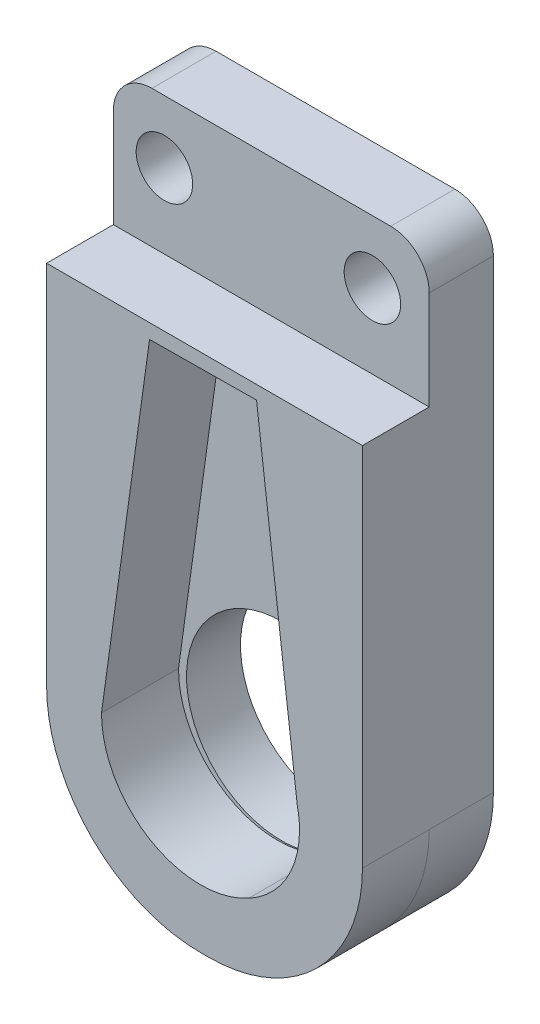
ISO-10303-21;
HEADER;
FILE_DESCRIPTION(('STEP AP214'),'2;1');
FILE_NAME('part.step','',(''),(''),'','','');
FILE_SCHEMA(('AUTOMOTIVE_DESIGN { 1 0 10303 214 1 1 1 1 }'));
ENDSEC;
DATA;
#1=APPLICATION_CONTEXT('core data for automotive mechanical design processes');
#2=APPLICATION_PROTOCOL_DEFINITION('international standard','automotive_design',2000,#1);
#3=PRODUCT_CONTEXT('',#1,'mechanical');
#4=PRODUCT('Part','Part','',(#3));
#5=PRODUCT_RELATED_PRODUCT_CATEGORY('part','',(#4));
#6=PRODUCT_DEFINITION_FORMATION('','',#4);
#7=PRODUCT_DEFINITION_CONTEXT('part definition',#1,'design');
#8=PRODUCT_DEFINITION('design','',#6,#7);
#9=PRODUCT_DEFINITION_SHAPE('','',#8);
#10=(LENGTH_UNIT() NAMED_UNIT(*) SI_UNIT(.MILLI.,.METRE.));
#11=(NAMED_UNIT(*) PLANE_ANGLE_UNIT() SI_UNIT($,.RADIAN.));
#12=(NAMED_UNIT(*) SI_UNIT($,.STERADIAN.) SOLID_ANGLE_UNIT());
#13=UNCERTAINTY_MEASURE_WITH_UNIT(LENGTH_MEASURE(1.E-05),#10,'distance_accuracy_value','');
#14=(GEOMETRIC_REPRESENTATION_CONTEXT(3) GLOBAL_UNCERTAINTY_ASSIGNED_CONTEXT((#13)) GLOBAL_UNIT_ASSIGNED_CONTEXT((#10,
#11,#12)) REPRESENTATION_CONTEXT('',''));
#15=CARTESIAN_POINT('',(0.,0.,0.));
#16=DIRECTION('',(0.,0.,1.));
#17=DIRECTION('',(1.,0.,0.));
#18=AXIS2_PLACEMENT_3D('',#15,#16,#17);
#19=CARTESIAN_POINT('',(-326.037234808109,240.363656002817,12.5));
#20=DIRECTION('',(1.,0.,0.));
#21=DIRECTION('',(0.,0.,-1.));
#22=AXIS2_PLACEMENT_3D('',#19,#20,#21);
#23=PLANE('',#22);
#24=DIRECTION('',(0.,0.,-1.));
#25=VECTOR('',#24,1.);
#26=CARTESIAN_POINT('',(-326.037234808109,220.763656002817,12.5));
#27=LINE('',#26,#25);
#28=CARTESIAN_POINT('',(-326.037234808109,220.763656002817,10.));
#29=VERTEX_POINT('',#28);
#30=CARTESIAN_POINT('',(-326.037234808109,220.763656002817,12.5));
#31=VERTEX_POINT('',#30);
#32=EDGE_CURVE('E239',#29,#31,#27,.F.);
#33=ORIENTED_EDGE('',*,*,#32,.T.);
#34=DIRECTION('',(0.,0.,-1.));
#35=VECTOR('',#34,1.);
#36=CARTESIAN_POINT('',(-326.037234808109,220.763656002817,12.5));
#37=LINE('',#36,#35);
#38=CARTESIAN_POINT('',(-326.037234808109,220.763656002817,15.1));
#39=VERTEX_POINT('',#38);
#40=EDGE_CURVE('E62',#31,#39,#37,.F.);
#41=ORIENTED_EDGE('',*,*,#40,.T.);
#42=DIRECTION('',(0.,-1.,0.));
#43=VECTOR('',#42,1.);
#44=CARTESIAN_POINT('',(-326.037234808109,235.015415168326,15.1));
#45=LINE('',#44,#43);
#46=CARTESIAN_POINT('',(-326.037234808109,235.015415168326,15.1));
#47=VERTEX_POINT('',#46);
#48=EDGE_CURVE('E290',#47,#39,#45,.T.);
#49=ORIENTED_EDGE('',*,*,#48,.F.);
#50=DIRECTION('',(0.,0.,-1.));
#51=VECTOR('',#50,1.);
#52=CARTESIAN_POINT('',(-326.037234808109,235.015415168326,15.1));
#53=LINE('',#52,#51);
#54=CARTESIAN_POINT('',(-326.037234808109,235.015415168326,12.5));
#55=VERTEX_POINT('',#54);
#56=EDGE_CURVE('E283',#47,#55,#53,.T.);
#57=ORIENTED_EDGE('',*,*,#56,.T.);
#58=DIRECTION('',(0.,-1.,0.));
#59=VECTOR('',#58,1.);
#60=CARTESIAN_POINT('',(-326.037234808109,240.363656002817,12.5));
#61=LINE('',#60,#59);
#62=CARTESIAN_POINT('',(-326.037234808109,238.863656002817,12.5));
#63=VERTEX_POINT('',#62);
#64=EDGE_CURVE('E262',#63,#55,#61,.T.);
#65=ORIENTED_EDGE('',*,*,#64,.F.);
#66=DIRECTION('',(0.,0.,-1.));
#67=VECTOR('',#66,1.);
#68=CARTESIAN_POINT('',(-326.037234808109,238.863656002817,12.5));
#69=LINE('',#68,#67);
#70=CARTESIAN_POINT('',(-326.037234808109,238.863656002817,10.));
#71=VERTEX_POINT('',#70);
#72=EDGE_CURVE('E236',#63,#71,#69,.T.);
#73=ORIENTED_EDGE('',*,*,#72,.T.);
#74=DIRECTION('',(0.,-1.,0.));
#75=VECTOR('',#74,1.);
#76=CARTESIAN_POINT('',(-326.037234808109,240.363656002817,10.));
#77=LINE('',#76,#75);
#78=EDGE_CURVE('E216',#71,#29,#77,.T.);
#79=ORIENTED_EDGE('',*,*,#78,.T.);
#80=EDGE_LOOP('',(#33,#41,#49,#57,#65,#73,#79));
#81=FACE_BOUND('',#80,.T.);
#82=ADVANCED_FACE('F36',(#81),#23,.F.);
#83=CARTESIAN_POINT('',(-326.037234808109,214.763656002817,12.5));
#84=DIRECTION('',(0.,1.,0.));
#85=DIRECTION('',(0.,0.,1.));
#86=AXIS2_PLACEMENT_3D('',#83,#84,#85);
#87=PLANE('',#86);
#88=DIRECTION('',(0.,0.,-1.));
#89=VECTOR('',#88,1.);
#90=CARTESIAN_POINT('',(-319.737234808109,214.763656002817,12.5));
#91=LINE('',#90,#89);
#92=CARTESIAN_POINT('',(-319.737234808109,214.763656002817,10.));
#93=VERTEX_POINT('',#92);
#94=CARTESIAN_POINT('',(-319.737234808109,214.763656002817,12.5));
#95=VERTEX_POINT('',#94);
#96=EDGE_CURVE('E245',#93,#95,#91,.F.);
#97=ORIENTED_EDGE('',*,*,#96,.T.);
#98=DIRECTION('',(0.,0.,-1.));
#99=VECTOR('',#98,1.);
#100=CARTESIAN_POINT('',(-319.737234808109,214.763656002817,12.5));
#101=LINE('',#100,#99);
#102=CARTESIAN_POINT('',(-319.737234808109,214.763656002817,15.1));
#103=VERTEX_POINT('',#102);
#104=EDGE_CURVE('E204',#95,#103,#101,.F.);
#105=ORIENTED_EDGE('',*,*,#104,.T.);
#106=DIRECTION('',(1.,0.,0.));
#107=VECTOR('',#106,1.);
#108=CARTESIAN_POINT('',(-326.037234808109,214.763656002817,15.1));
#109=LINE('',#108,#107);
#110=CARTESIAN_POINT('',(-320.037234808109,214.763656002817,15.1));
#111=VERTEX_POINT('',#110);
#112=EDGE_CURVE('E295',#111,#103,#109,.T.);
#113=ORIENTED_EDGE('',*,*,#112,.F.);
#114=DIRECTION('',(0.,0.,-1.));
#115=VECTOR('',#114,1.);
#116=CARTESIAN_POINT('',(-320.037234808109,214.763656002817,12.5));
#117=LINE('',#116,#115);
#118=CARTESIAN_POINT('',(-320.037234808109,214.763656002817,12.5));
#119=VERTEX_POINT('',#118);
#120=EDGE_CURVE('E206',#111,#119,#117,.T.);
#121=ORIENTED_EDGE('',*,*,#120,.T.);
#122=DIRECTION('',(0.,0.,-1.));
#123=VECTOR('',#122,1.);
#124=CARTESIAN_POINT('',(-320.037234808109,214.763656002817,12.5));
#125=LINE('',#124,#123);
#126=CARTESIAN_POINT('',(-320.037234808109,214.763656002817,10.));
#127=VERTEX_POINT('',#126);
#128=EDGE_CURVE('E247',#119,#127,#125,.T.);
#129=ORIENTED_EDGE('',*,*,#128,.T.);
#130=DIRECTION('',(1.,0.,0.));
#131=VECTOR('',#130,1.);
#132=CARTESIAN_POINT('',(-326.037234808109,214.763656002817,10.));
#133=LINE('',#132,#131);
#134=EDGE_CURVE('E266',#127,#93,#133,.T.);
#135=ORIENTED_EDGE('',*,*,#134,.T.);
#136=EDGE_LOOP('',(#97,#105,#113,#121,#129,#135));
#137=FACE_BOUND('',#136,.T.);
#138=ADVANCED_FACE('F325',(#137),#87,.F.);
#139=CARTESIAN_POINT('',(-313.737234808109,240.363656002817,12.5));
#140=DIRECTION('',(-1.,0.,0.));
#141=DIRECTION('',(0.,-1.,0.));
#142=AXIS2_PLACEMENT_3D('',#139,#140,#141);
#143=PLANE('',#142);
#144=DIRECTION('',(0.,1.,0.));
#145=VECTOR('',#144,1.);
#146=CARTESIAN_POINT('',(-313.737234808109,235.015415168326,15.1));
#147=LINE('',#146,#145);
#148=CARTESIAN_POINT('',(-313.737234808109,220.763656002817,15.1));
#149=VERTEX_POINT('',#148);
#150=CARTESIAN_POINT('',(-313.737234808109,235.015415168326,15.1));
#151=VERTEX_POINT('',#150);
#152=EDGE_CURVE('E293',#149,#151,#147,.T.);
#153=ORIENTED_EDGE('',*,*,#152,.F.);
#154=DIRECTION('',(0.,0.,-1.));
#155=VECTOR('',#154,1.);
#156=CARTESIAN_POINT('',(-313.737234808109,220.763656002817,12.5));
#157=LINE('',#156,#155);
#158=CARTESIAN_POINT('',(-313.737234808109,220.763656002817,12.5));
#159=VERTEX_POINT('',#158);
#160=EDGE_CURVE('E209',#149,#159,#157,.T.);
#161=ORIENTED_EDGE('',*,*,#160,.T.);
#162=DIRECTION('',(0.,0.,-1.));
#163=VECTOR('',#162,1.);
#164=CARTESIAN_POINT('',(-313.737234808109,220.763656002817,12.5));
#165=LINE('',#164,#163);
#166=CARTESIAN_POINT('',(-313.737234808109,220.763656002817,10.));
#167=VERTEX_POINT('',#166);
#168=EDGE_CURVE('E255',#159,#167,#165,.T.);
#169=ORIENTED_EDGE('',*,*,#168,.T.);
#170=DIRECTION('',(0.,1.,0.));
#171=VECTOR('',#170,1.);
#172=CARTESIAN_POINT('',(-313.737234808109,240.363656002817,10.));
#173=LINE('',#172,#171);
#174=CARTESIAN_POINT('',(-313.737234808109,238.863656002817,10.));
#175=VERTEX_POINT('',#174);
#176=EDGE_CURVE('E263',#167,#175,#173,.T.);
#177=ORIENTED_EDGE('',*,*,#176,.T.);
#178=DIRECTION('',(0.,0.,-1.));
#179=VECTOR('',#178,1.);
#180=CARTESIAN_POINT('',(-313.737234808109,238.863656002817,12.5));
#181=LINE('',#180,#179);
#182=CARTESIAN_POINT('',(-313.737234808109,238.863656002817,12.5));
#183=VERTEX_POINT('',#182);
#184=EDGE_CURVE('E212',#175,#183,#181,.F.);
#185=ORIENTED_EDGE('',*,*,#184,.T.);
#186=DIRECTION('',(0.,1.,0.));
#187=VECTOR('',#186,1.);
#188=CARTESIAN_POINT('',(-313.737234808109,240.363656002817,12.5));
#189=LINE('',#188,#187);
#190=CARTESIAN_POINT('',(-313.737234808109,235.015415168326,12.5));
#191=VERTEX_POINT('',#190);
#192=EDGE_CURVE('E272',#191,#183,#189,.T.);
#193=ORIENTED_EDGE('',*,*,#192,.F.);
#194=DIRECTION('',(0.,0.,-1.));
#195=VECTOR('',#194,1.);
#196=CARTESIAN_POINT('',(-313.737234808109,235.015415168326,15.1));
#197=LINE('',#196,#195);
#198=EDGE_CURVE('E278',#151,#191,#197,.T.);
#199=ORIENTED_EDGE('',*,*,#198,.F.);
#200=EDGE_LOOP('',(#153,#161,#169,#177,#185,#193,#199));
#201=FACE_BOUND('',#200,.T.);
#202=ADVANCED_FACE('F330',(#201),#143,.F.);
#203=CARTESIAN_POINT('',(-326.037234808109,240.363656002817,12.5));
#204=DIRECTION('',(0.,-1.,0.));
#205=DIRECTION('',(0.,0.,-1.));
#206=AXIS2_PLACEMENT_3D('',#203,#204,#205);
#207=PLANE('',#206);
#208=DIRECTION('',(-1.,0.,0.));
#209=VECTOR('',#208,1.);
#210=CARTESIAN_POINT('',(-326.037234808109,240.363656002817,10.));
#211=LINE('',#210,#209);
#212=CARTESIAN_POINT('',(-315.237234808109,240.363656002817,10.));
#213=VERTEX_POINT('',#212);
#214=CARTESIAN_POINT('',(-324.537234808109,240.363656002817,10.));
#215=VERTEX_POINT('',#214);
#216=EDGE_CURVE('E259',#213,#215,#211,.T.);
#217=ORIENTED_EDGE('',*,*,#216,.T.);
#218=DIRECTION('',(0.,0.,-1.));
#219=VECTOR('',#218,1.);
#220=CARTESIAN_POINT('',(-324.537234808109,240.363656002817,12.5));
#221=LINE('',#220,#219);
#222=CARTESIAN_POINT('',(-324.537234808109,240.363656002817,12.5));
#223=VERTEX_POINT('',#222);
#224=EDGE_CURVE('E227',#215,#223,#221,.F.);
#225=ORIENTED_EDGE('',*,*,#224,.T.);
#226=DIRECTION('',(-1.,0.,0.));
#227=VECTOR('',#226,1.);
#228=CARTESIAN_POINT('',(-326.037234808109,240.363656002817,12.5));
#229=LINE('',#228,#227);
#230=CARTESIAN_POINT('',(-315.237234808109,240.363656002817,12.5));
#231=VERTEX_POINT('',#230);
#232=EDGE_CURVE('E258',#231,#223,#229,.T.);
#233=ORIENTED_EDGE('',*,*,#232,.F.);
#234=DIRECTION('',(0.,0.,-1.));
#235=VECTOR('',#234,1.);
#236=CARTESIAN_POINT('',(-315.237234808109,240.363656002817,12.5));
#237=LINE('',#236,#235);
#238=EDGE_CURVE('E229',#231,#213,#237,.T.);
#239=ORIENTED_EDGE('',*,*,#238,.T.);
#240=EDGE_LOOP('',(#217,#225,#233,#239));
#241=FACE_BOUND('',#240,.T.);
#242=ADVANCED_FACE('F389',(#241),#207,.F.);
#243=CARTESIAN_POINT('',(0.,0.,12.5));
#244=DIRECTION('',(0.,0.,1.));
#245=DIRECTION('',(1.,0.,0.));
#246=AXIS2_PLACEMENT_3D('',#243,#244,#245);
#247=PLANE('',#246);
#248=DIRECTION('',(-1.,0.,0.));
#249=VECTOR('',#248,1.);
#250=CARTESIAN_POINT('',(-326.037234808109,235.015415168326,12.5));
#251=LINE('',#250,#249);
#252=EDGE_CURVE('E287',#191,#55,#251,.T.);
#253=ORIENTED_EDGE('',*,*,#252,.F.);
#254=ORIENTED_EDGE('',*,*,#192,.T.);
#255=CARTESIAN_POINT('',(-315.237234808109,238.863656002817,12.5));
#256=DIRECTION('',(0.,0.,1.));
#257=DIRECTION('',(1.,0.,0.));
#258=AXIS2_PLACEMENT_3D('',#255,#256,#257);
#259=CIRCLE('',#258,1.5);
#260=EDGE_CURVE('E225',#183,#231,#259,.T.);
#261=ORIENTED_EDGE('',*,*,#260,.T.);
#262=ORIENTED_EDGE('',*,*,#232,.T.);
#263=CARTESIAN_POINT('',(-324.537234808109,238.863656002817,12.5));
#264=DIRECTION('',(0.,0.,1.));
#265=DIRECTION('',(1.,0.,0.));
#266=AXIS2_PLACEMENT_3D('',#263,#264,#265);
#267=CIRCLE('',#266,1.5);
#268=EDGE_CURVE('E223',#223,#63,#267,.T.);
#269=ORIENTED_EDGE('',*,*,#268,.T.);
#270=ORIENTED_EDGE('',*,*,#64,.T.);
#271=EDGE_LOOP('',(#253,#254,#261,#262,#269,#270));
#272=FACE_BOUND('',#271,.T.);
#273=CARTESIAN_POINT('',(-324.049090595756,237.922314015465,12.5));
#274=DIRECTION('',(0.,0.,1.));
#275=DIRECTION('',(1.,0.,0.));
#276=AXIS2_PLACEMENT_3D('',#273,#274,#275);
#277=CIRCLE('',#276,1.09999999999999);
#278=CARTESIAN_POINT('',(-322.949090595756,237.922314015465,12.5));
#279=VERTEX_POINT('',#278);
#280=EDGE_CURVE('E220',#279,#279,#277,.T.);
#281=ORIENTED_EDGE('',*,*,#280,.F.);
#282=EDGE_LOOP('',(#281));
#283=FACE_BOUND('',#282,.T.);
#284=CARTESIAN_POINT('',(-315.949090595756,237.922314015465,12.5));
#285=DIRECTION('',(0.,0.,1.));
#286=DIRECTION('',(1.,0.,0.));
#287=AXIS2_PLACEMENT_3D('',#284,#285,#286);
#288=CIRCLE('',#287,1.09999999999999);
#289=CARTESIAN_POINT('',(-314.849090595756,237.922314015465,12.5));
#290=VERTEX_POINT('',#289);
#291=EDGE_CURVE('E275',#290,#290,#288,.T.);
#292=ORIENTED_EDGE('',*,*,#291,.F.);
#293=EDGE_LOOP('',(#292));
#294=FACE_BOUND('',#293,.T.);
#295=ADVANCED_FACE('F393',(#272,#283,#294),#247,.T.);
#296=CARTESIAN_POINT('',(0.,0.,10.));
#297=DIRECTION('',(0.,0.,1.));
#298=DIRECTION('',(1.,0.,0.));
#299=AXIS2_PLACEMENT_3D('',#296,#297,#298);
#300=PLANE('',#299);
#301=CARTESIAN_POINT('',(-319.887234808109,220.812052897843,10.));
#302=DIRECTION('',(0.,0.,1.));
#303=DIRECTION('',(1.,0.,0.));
#304=AXIS2_PLACEMENT_3D('',#301,#302,#303);
#305=CIRCLE('',#304,3.70000000000001);
#306=CARTESIAN_POINT('',(-316.187234808108,220.812052897843,10.));
#307=VERTEX_POINT('',#306);
#308=EDGE_CURVE('E291',#307,#307,#305,.T.);
#309=ORIENTED_EDGE('',*,*,#308,.T.);
#310=EDGE_LOOP('',(#309));
#311=FACE_BOUND('',#310,.T.);
#312=CARTESIAN_POINT('',(-324.049090595756,237.922314015465,10.));
#313=DIRECTION('',(0.,0.,1.));
#314=DIRECTION('',(1.,0.,0.));
#315=AXIS2_PLACEMENT_3D('',#312,#313,#314);
#316=CIRCLE('',#315,1.09999999999999);
#317=CARTESIAN_POINT('',(-322.949090595756,237.922314015465,10.));
#318=VERTEX_POINT('',#317);
#319=EDGE_CURVE('E213',#318,#318,#316,.T.);
#320=ORIENTED_EDGE('',*,*,#319,.T.);
#321=EDGE_LOOP('',(#320));
#322=FACE_BOUND('',#321,.T.);
#323=CARTESIAN_POINT('',(-315.949090595756,237.922314015465,10.));
#324=DIRECTION('',(0.,0.,1.));
#325=DIRECTION('',(1.,0.,0.));
#326=AXIS2_PLACEMENT_3D('',#323,#324,#325);
#327=CIRCLE('',#326,1.09999999999999);
#328=CARTESIAN_POINT('',(-314.849090595756,237.922314015465,10.));
#329=VERTEX_POINT('',#328);
#330=EDGE_CURVE('E217',#329,#329,#327,.T.);
#331=ORIENTED_EDGE('',*,*,#330,.T.);
#332=EDGE_LOOP('',(#331));
#333=FACE_BOUND('',#332,.T.);
#334=ORIENTED_EDGE('',*,*,#78,.F.);
#335=CARTESIAN_POINT('',(-324.537234808109,238.863656002817,10.));
#336=DIRECTION('',(0.,0.,1.));
#337=DIRECTION('',(1.,0.,0.));
#338=AXIS2_PLACEMENT_3D('',#335,#336,#337);
#339=CIRCLE('',#338,1.5);
#340=EDGE_CURVE('E232',#71,#215,#339,.F.);
#341=ORIENTED_EDGE('',*,*,#340,.T.);
#342=ORIENTED_EDGE('',*,*,#216,.F.);
#343=CARTESIAN_POINT('',(-315.237234808109,238.863656002817,10.));
#344=DIRECTION('',(0.,0.,1.));
#345=DIRECTION('',(1.,0.,0.));
#346=AXIS2_PLACEMENT_3D('',#343,#344,#345);
#347=CIRCLE('',#346,1.5);
#348=EDGE_CURVE('E234',#213,#175,#347,.F.);
#349=ORIENTED_EDGE('',*,*,#348,.T.);
#350=ORIENTED_EDGE('',*,*,#176,.F.);
#351=CARTESIAN_POINT('',(-319.737234808109,220.763656002817,10.));
#352=DIRECTION('',(0.,0.,1.));
#353=DIRECTION('',(1.,0.,0.));
#354=AXIS2_PLACEMENT_3D('',#351,#352,#353);
#355=CIRCLE('',#354,6.);
#356=EDGE_CURVE('E250',#167,#93,#355,.F.);
#357=ORIENTED_EDGE('',*,*,#356,.T.);
#358=ORIENTED_EDGE('',*,*,#134,.F.);
#359=CARTESIAN_POINT('',(-320.037234808109,220.763656002817,10.));
#360=DIRECTION('',(0.,0.,1.));
#361=DIRECTION('',(1.,0.,0.));
#362=AXIS2_PLACEMENT_3D('',#359,#360,#361);
#363=CIRCLE('',#362,6.);
#364=EDGE_CURVE('E252',#127,#29,#363,.F.);
#365=ORIENTED_EDGE('',*,*,#364,.T.);
#366=EDGE_LOOP('',(#334,#341,#342,#349,#350,#357,#358,#365));
#367=FACE_BOUND('',#366,.T.);
#368=ADVANCED_FACE('F306',(#311,#322,#333,#367),#300,.F.);
#369=CARTESIAN_POINT('',(-319.737234808109,220.763656002817,12.5));
#370=DIRECTION('',(0.,0.,-1.));
#371=DIRECTION('',(-1.,0.,0.));
#372=AXIS2_PLACEMENT_3D('',#369,#370,#371);
#373=CYLINDRICAL_SURFACE('',#372,6.);
#374=CARTESIAN_POINT('',(-319.737234808109,220.763656002817,12.5));
#375=DIRECTION('',(0.,0.,1.));
#376=DIRECTION('',(1.,0.,0.));
#377=AXIS2_PLACEMENT_3D('',#374,#375,#376);
#378=CIRCLE('',#377,6.);
#379=EDGE_CURVE('E241',#95,#159,#378,.T.);
#380=ORIENTED_EDGE('',*,*,#379,.F.);
#381=ORIENTED_EDGE('',*,*,#96,.F.);
#382=ORIENTED_EDGE('',*,*,#356,.F.);
#383=ORIENTED_EDGE('',*,*,#168,.F.);
#384=EDGE_LOOP('',(#380,#381,#382,#383));
#385=FACE_BOUND('',#384,.T.);
#386=ADVANCED_FACE('F335',(#385),#373,.T.);
#387=CARTESIAN_POINT('',(-320.037234808109,220.763656002817,12.5));
#388=DIRECTION('',(0.,0.,-1.));
#389=DIRECTION('',(-1.,0.,0.));
#390=AXIS2_PLACEMENT_3D('',#387,#388,#389);
#391=CYLINDRICAL_SURFACE('',#390,6.);
#392=CARTESIAN_POINT('',(-320.037234808109,220.763656002817,12.5));
#393=DIRECTION('',(0.,0.,1.));
#394=DIRECTION('',(1.,0.,0.));
#395=AXIS2_PLACEMENT_3D('',#392,#393,#394);
#396=CIRCLE('',#395,6.);
#397=EDGE_CURVE('E243',#31,#119,#396,.T.);
#398=ORIENTED_EDGE('',*,*,#397,.F.);
#399=ORIENTED_EDGE('',*,*,#32,.F.);
#400=ORIENTED_EDGE('',*,*,#364,.F.);
#401=ORIENTED_EDGE('',*,*,#128,.F.);
#402=EDGE_LOOP('',(#398,#399,#400,#401));
#403=FACE_BOUND('',#402,.T.);
#404=ADVANCED_FACE('F338',(#403),#391,.T.);
#405=CARTESIAN_POINT('',(-324.537234808109,238.863656002817,12.5));
#406=DIRECTION('',(0.,0.,-1.));
#407=DIRECTION('',(-1.,0.,0.));
#408=AXIS2_PLACEMENT_3D('',#405,#406,#407);
#409=CYLINDRICAL_SURFACE('',#408,1.5);
#410=ORIENTED_EDGE('',*,*,#268,.F.);
#411=ORIENTED_EDGE('',*,*,#224,.F.);
#412=ORIENTED_EDGE('',*,*,#340,.F.);
#413=ORIENTED_EDGE('',*,*,#72,.F.);
#414=EDGE_LOOP('',(#410,#411,#412,#413));
#415=FACE_BOUND('',#414,.T.);
#416=ADVANCED_FACE('F342',(#415),#409,.T.);
#417=CARTESIAN_POINT('',(-315.237234808109,238.863656002817,12.5));
#418=DIRECTION('',(0.,0.,-1.));
#419=DIRECTION('',(-1.,0.,0.));
#420=AXIS2_PLACEMENT_3D('',#417,#418,#419);
#421=CYLINDRICAL_SURFACE('',#420,1.5);
#422=ORIENTED_EDGE('',*,*,#260,.F.);
#423=ORIENTED_EDGE('',*,*,#184,.F.);
#424=ORIENTED_EDGE('',*,*,#348,.F.);
#425=ORIENTED_EDGE('',*,*,#238,.F.);
#426=EDGE_LOOP('',(#422,#423,#424,#425));
#427=FACE_BOUND('',#426,.T.);
#428=ADVANCED_FACE('F346',(#427),#421,.T.);
#429=CARTESIAN_POINT('',(-315.949090595756,237.922314015465,9.));
#430=DIRECTION('',(0.,0.,1.));
#431=DIRECTION('',(1.,0.,0.));
#432=AXIS2_PLACEMENT_3D('',#429,#430,#431);
#433=CYLINDRICAL_SURFACE('',#432,1.09999999999999);
#434=ORIENTED_EDGE('',*,*,#291,.T.);
#435=EDGE_LOOP('',(#434));
#436=FACE_BOUND('',#435,.T.);
#437=ORIENTED_EDGE('',*,*,#330,.F.);
#438=EDGE_LOOP('',(#437));
#439=FACE_BOUND('',#438,.T.);
#440=ADVANCED_FACE('F349',(#436,#439),#433,.F.);
#441=CARTESIAN_POINT('',(-324.049090595756,237.922314015465,9.));
#442=DIRECTION('',(0.,0.,1.));
#443=DIRECTION('',(1.,0.,0.));
#444=AXIS2_PLACEMENT_3D('',#441,#442,#443);
#445=CYLINDRICAL_SURFACE('',#444,1.09999999999999);
#446=ORIENTED_EDGE('',*,*,#280,.T.);
#447=EDGE_LOOP('',(#446));
#448=FACE_BOUND('',#447,.T.);
#449=ORIENTED_EDGE('',*,*,#319,.F.);
#450=EDGE_LOOP('',(#449));
#451=FACE_BOUND('',#450,.T.);
#452=ADVANCED_FACE('F405',(#448,#451),#445,.F.);
#453=CARTESIAN_POINT('',(-326.037234808109,235.015415168326,15.1));
#454=DIRECTION('',(0.,-1.,0.));
#455=DIRECTION('',(0.,0.,-1.));
#456=AXIS2_PLACEMENT_3D('',#453,#454,#455);
#457=PLANE('',#456);
#458=ORIENTED_EDGE('',*,*,#252,.T.);
#459=ORIENTED_EDGE('',*,*,#56,.F.);
#460=DIRECTION('',(-1.,0.,0.));
#461=VECTOR('',#460,1.);
#462=CARTESIAN_POINT('',(-326.037234808109,235.015415168326,15.1));
#463=LINE('',#462,#461);
#464=EDGE_CURVE('E286',#151,#47,#463,.T.);
#465=ORIENTED_EDGE('',*,*,#464,.F.);
#466=ORIENTED_EDGE('',*,*,#198,.T.);
#467=EDGE_LOOP('',(#458,#459,#465,#466));
#468=FACE_BOUND('',#467,.T.);
#469=ADVANCED_FACE('F357',(#468),#457,.F.);
#470=CARTESIAN_POINT('',(0.,0.,15.1));
#471=DIRECTION('',(0.,0.,1.));
#472=DIRECTION('',(1.,0.,0.));
#473=AXIS2_PLACEMENT_3D('',#470,#471,#472);
#474=PLANE('',#473);
#475=DIRECTION('',(-0.122313915928917,0.992491463928095,0.));
#476=VECTOR('',#475,1.);
#477=CARTESIAN_POINT('',(-317.861572265625,234.48600769043,15.1));
#478=LINE('',#477,#476);
#479=CARTESIAN_POINT('',(-316.275294568436,221.614479034653,15.1));
#480=VERTEX_POINT('',#479);
#481=CARTESIAN_POINT('',(-317.861572265625,234.48600769043,15.1));
#482=VERTEX_POINT('',#481);
#483=EDGE_CURVE('E182',#480,#482,#478,.T.);
#484=ORIENTED_EDGE('',*,*,#483,.F.);
#485=CARTESIAN_POINT('',(-319.887234808109,220.812052897843,15.1));
#486=DIRECTION('',(0.,0.,1.));
#487=DIRECTION('',(1.,0.,0.));
#488=AXIS2_PLACEMENT_3D('',#485,#486,#487);
#489=CIRCLE('',#488,3.70000000000001);
#490=CARTESIAN_POINT('',(-318.155809055729,217.542165305891,15.1));
#491=VERTEX_POINT('',#490);
#492=EDGE_CURVE('E193',#491,#480,#489,.T.);
#493=ORIENTED_EDGE('',*,*,#492,.F.);
#494=CARTESIAN_POINT('',(-320.043758733238,220.90346779848,15.1));
#495=DIRECTION('',(0.,0.,1.));
#496=DIRECTION('',(1.,0.,0.));
#497=AXIS2_PLACEMENT_3D('',#494,#495,#496);
#498=CIRCLE('',#497,3.85521833772007);
#499=CARTESIAN_POINT('',(-323.898951354693,220.917549097156,15.1));
#500=VERTEX_POINT('',#499);
#501=EDGE_CURVE('E188',#500,#491,#498,.T.);
#502=ORIENTED_EDGE('',*,*,#501,.F.);
#503=DIRECTION('',(-0.136949267373716,-0.990578062631009,0.));
#504=VECTOR('',#503,1.);
#505=CARTESIAN_POINT('',(-322.028238528826,234.448742964222,15.1));
#506=LINE('',#505,#504);
#507=CARTESIAN_POINT('',(-322.028238528826,234.448742964222,15.1));
#508=VERTEX_POINT('',#507);
#509=EDGE_CURVE('E165',#508,#500,#506,.T.);
#510=ORIENTED_EDGE('',*,*,#509,.F.);
#511=DIRECTION('',(-0.999960008988507,-0.0089431774948453,0.));
#512=VECTOR('',#511,1.);
#513=CARTESIAN_POINT('',(-322.028238528826,234.448742964222,15.1));
#514=LINE('',#513,#512);
#515=EDGE_CURVE('E179',#482,#508,#514,.T.);
#516=ORIENTED_EDGE('',*,*,#515,.F.);
#517=EDGE_LOOP('',(#484,#493,#502,#510,#516));
#518=FACE_BOUND('',#517,.T.);
#519=ORIENTED_EDGE('',*,*,#112,.T.);
#520=CARTESIAN_POINT('',(-319.737234808109,220.763656002817,15.1));
#521=DIRECTION('',(0.,0.,1.));
#522=DIRECTION('',(1.,0.,0.));
#523=AXIS2_PLACEMENT_3D('',#520,#521,#522);
#524=CIRCLE('',#523,6.);
#525=EDGE_CURVE('E200',#103,#149,#524,.T.);
#526=ORIENTED_EDGE('',*,*,#525,.T.);
#527=ORIENTED_EDGE('',*,*,#152,.T.);
#528=ORIENTED_EDGE('',*,*,#464,.T.);
#529=ORIENTED_EDGE('',*,*,#48,.T.);
#530=CARTESIAN_POINT('',(-320.037234808109,220.763656002817,15.1));
#531=DIRECTION('',(0.,0.,1.));
#532=DIRECTION('',(1.,0.,0.));
#533=AXIS2_PLACEMENT_3D('',#530,#531,#532);
#534=CIRCLE('',#533,6.);
#535=EDGE_CURVE('E202',#39,#111,#534,.T.);
#536=ORIENTED_EDGE('',*,*,#535,.T.);
#537=EDGE_LOOP('',(#519,#526,#527,#528,#529,#536));
#538=FACE_BOUND('',#537,.T.);
#539=ADVANCED_FACE('F352',(#518,#538),#474,.T.);
#540=CARTESIAN_POINT('',(-319.737234808109,220.763656002817,12.5));
#541=DIRECTION('',(0.,0.,-1.));
#542=DIRECTION('',(-1.,0.,0.));
#543=AXIS2_PLACEMENT_3D('',#540,#541,#542);
#544=CYLINDRICAL_SURFACE('',#543,6.);
#545=ORIENTED_EDGE('',*,*,#525,.F.);
#546=ORIENTED_EDGE('',*,*,#104,.F.);
#547=ORIENTED_EDGE('',*,*,#379,.T.);
#548=ORIENTED_EDGE('',*,*,#160,.F.);
#549=EDGE_LOOP('',(#545,#546,#547,#548));
#550=FACE_BOUND('',#549,.T.);
#551=ADVANCED_FACE('F320',(#550),#544,.T.);
#552=CARTESIAN_POINT('',(-320.037234808109,220.763656002817,12.5));
#553=DIRECTION('',(0.,0.,-1.));
#554=DIRECTION('',(-1.,0.,0.));
#555=AXIS2_PLACEMENT_3D('',#552,#553,#554);
#556=CYLINDRICAL_SURFACE('',#555,6.);
#557=ORIENTED_EDGE('',*,*,#535,.F.);
#558=ORIENTED_EDGE('',*,*,#40,.F.);
#559=ORIENTED_EDGE('',*,*,#397,.T.);
#560=ORIENTED_EDGE('',*,*,#120,.F.);
#561=EDGE_LOOP('',(#557,#558,#559,#560));
#562=FACE_BOUND('',#561,.T.);
#563=ADVANCED_FACE('F38',(#562),#556,.T.);
#564=CARTESIAN_POINT('',(-319.887234808109,220.812052897843,10.));
#565=DIRECTION('',(0.,0.,1.));
#566=DIRECTION('',(1.,0.,0.));
#567=AXIS2_PLACEMENT_3D('',#564,#565,#566);
#568=CYLINDRICAL_SURFACE('',#567,3.70000000000001);
#569=ORIENTED_EDGE('',*,*,#492,.T.);
#570=DIRECTION('',(0.,0.,1.));
#571=VECTOR('',#570,1.);
#572=CARTESIAN_POINT('',(-316.275294568436,221.614479034653,10.));
#573=LINE('',#572,#571);
#574=CARTESIAN_POINT('',(-316.275294568436,221.614479034653,12.1));
#575=VERTEX_POINT('',#574);
#576=EDGE_CURVE('E11',#480,#575,#573,.F.);
#577=ORIENTED_EDGE('',*,*,#576,.T.);
#578=CARTESIAN_POINT('',(-319.887234808109,220.812052897843,12.1));
#579=DIRECTION('',(0.,0.,1.));
#580=DIRECTION('',(1.,0.,0.));
#581=AXIS2_PLACEMENT_3D('',#578,#579,#580);
#582=CIRCLE('',#581,3.70000000000001);
#583=CARTESIAN_POINT('',(-318.155809055729,217.542165305891,12.1));
#584=VERTEX_POINT('',#583);
#585=EDGE_CURVE('E40',#584,#575,#582,.F.);
#586=ORIENTED_EDGE('',*,*,#585,.F.);
#587=DIRECTION('',(0.,0.,1.));
#588=VECTOR('',#587,1.);
#589=CARTESIAN_POINT('',(-318.155809055729,217.542165305891,13.6));
#590=LINE('',#589,#588);
#591=EDGE_CURVE('E46',#584,#491,#590,.T.);
#592=ORIENTED_EDGE('',*,*,#591,.T.);
#593=EDGE_LOOP('',(#569,#577,#586,#592));
#594=FACE_BOUND('',#593,.T.);
#595=ORIENTED_EDGE('',*,*,#308,.F.);
#596=EDGE_LOOP('',(#595));
#597=FACE_BOUND('',#596,.T.);
#598=ADVANCED_FACE('F309',(#594,#597),#568,.F.);
#599=CARTESIAN_POINT('',(-317.861572265625,234.48600769043,12.1));
#600=DIRECTION('',(0.992491463928095,0.122313915928917,0.));
#601=DIRECTION('',(-0.122313915928917,0.992491463928095,0.));
#602=AXIS2_PLACEMENT_3D('',#599,#600,#601);
#603=PLANE('',#602);
#604=ORIENTED_EDGE('',*,*,#483,.T.);
#605=DIRECTION('',(0.,0.,1.));
#606=VECTOR('',#605,1.);
#607=CARTESIAN_POINT('',(-317.861572265625,234.48600769043,12.1));
#608=LINE('',#607,#606);
#609=CARTESIAN_POINT('',(-317.861572265625,234.48600769043,12.1));
#610=VERTEX_POINT('',#609);
#611=EDGE_CURVE('E169',#610,#482,#608,.T.);
#612=ORIENTED_EDGE('',*,*,#611,.F.);
#613=DIRECTION('',(-0.122313915928917,0.992491463928095,0.));
#614=VECTOR('',#613,1.);
#615=CARTESIAN_POINT('',(-317.861572265625,234.48600769043,12.1));
#616=LINE('',#615,#614);
#617=EDGE_CURVE('E175',#575,#610,#616,.T.);
#618=ORIENTED_EDGE('',*,*,#617,.F.);
#619=ORIENTED_EDGE('',*,*,#576,.F.);
#620=EDGE_LOOP('',(#604,#612,#618,#619));
#621=FACE_BOUND('',#620,.T.);
#622=ADVANCED_FACE('F311',(#621),#603,.F.);
#623=CARTESIAN_POINT('',(-320.043758733238,220.90346779848,12.1));
#624=DIRECTION('',(0.,0.,1.));
#625=DIRECTION('',(1.,0.,0.));
#626=AXIS2_PLACEMENT_3D('',#623,#624,#625);
#627=CYLINDRICAL_SURFACE('',#626,3.85521833772007);
#628=CARTESIAN_POINT('',(-320.043758733238,220.90346779848,12.1));
#629=DIRECTION('',(0.,0.,1.));
#630=DIRECTION('',(1.,0.,0.));
#631=AXIS2_PLACEMENT_3D('',#628,#629,#630);
#632=CIRCLE('',#631,3.85521833772007);
#633=CARTESIAN_POINT('',(-323.898951354693,220.917549097156,12.1));
#634=VERTEX_POINT('',#633);
#635=EDGE_CURVE('E54',#634,#584,#632,.T.);
#636=ORIENTED_EDGE('',*,*,#635,.F.);
#637=DIRECTION('',(0.,0.,1.));
#638=VECTOR('',#637,1.);
#639=CARTESIAN_POINT('',(-323.898951354693,220.917549097156,12.1));
#640=LINE('',#639,#638);
#641=EDGE_CURVE('E160',#634,#500,#640,.T.);
#642=ORIENTED_EDGE('',*,*,#641,.T.);
#643=ORIENTED_EDGE('',*,*,#501,.T.);
#644=ORIENTED_EDGE('',*,*,#591,.F.);
#645=EDGE_LOOP('',(#636,#642,#643,#644));
#646=FACE_BOUND('',#645,.T.);
#647=ADVANCED_FACE('F172',(#646),#627,.F.);
#648=CARTESIAN_POINT('',(-320.043758733238,220.90346779848,12.1));
#649=DIRECTION('',(0.,0.,1.));
#650=DIRECTION('',(1.,0.,0.));
#651=AXIS2_PLACEMENT_3D('',#648,#649,#650);
#652=PLANE('',#651);
#653=ORIENTED_EDGE('',*,*,#585,.T.);
#654=ORIENTED_EDGE('',*,*,#617,.T.);
#655=DIRECTION('',(-0.999960008988507,-0.0089431774948453,0.));
#656=VECTOR('',#655,1.);
#657=CARTESIAN_POINT('',(-322.028238528826,234.448742964222,12.1));
#658=LINE('',#657,#656);
#659=CARTESIAN_POINT('',(-322.028238528826,234.448742964222,12.1));
#660=VERTEX_POINT('',#659);
#661=EDGE_CURVE('E170',#610,#660,#658,.T.);
#662=ORIENTED_EDGE('',*,*,#661,.T.);
#663=DIRECTION('',(-0.136949267373716,-0.990578062631009,0.));
#664=VECTOR('',#663,1.);
#665=CARTESIAN_POINT('',(-322.028238528826,234.448742964222,12.1));
#666=LINE('',#665,#664);
#667=EDGE_CURVE('E162',#660,#634,#666,.T.);
#668=ORIENTED_EDGE('',*,*,#667,.T.);
#669=ORIENTED_EDGE('',*,*,#635,.T.);
#670=EDGE_LOOP('',(#653,#654,#662,#668,#669));
#671=FACE_BOUND('',#670,.T.);
#672=ADVANCED_FACE('F177',(#671),#652,.T.);
#673=CARTESIAN_POINT('',(-322.028238528826,234.448742964222,12.1));
#674=DIRECTION('',(-0.990578062631009,0.136949267373716,0.));
#675=DIRECTION('',(-0.136949267373716,-0.990578062631009,0.));
#676=AXIS2_PLACEMENT_3D('',#673,#674,#675);
#677=PLANE('',#676);
#678=ORIENTED_EDGE('',*,*,#509,.T.);
#679=ORIENTED_EDGE('',*,*,#641,.F.);
#680=ORIENTED_EDGE('',*,*,#667,.F.);
#681=DIRECTION('',(0.,0.,1.));
#682=VECTOR('',#681,1.);
#683=CARTESIAN_POINT('',(-322.028238528826,234.448742964222,12.1));
#684=LINE('',#683,#682);
#685=EDGE_CURVE('E191',#660,#508,#684,.T.);
#686=ORIENTED_EDGE('',*,*,#685,.T.);
#687=EDGE_LOOP('',(#678,#679,#680,#686));
#688=FACE_BOUND('',#687,.T.);
#689=ADVANCED_FACE('F161',(#688),#677,.F.);
#690=CARTESIAN_POINT('',(-322.028238528826,234.448742964222,12.1));
#691=DIRECTION('',(-0.0089431774948453,0.999960008988507,0.));
#692=DIRECTION('',(-0.999960008988507,-0.0089431774948453,0.));
#693=AXIS2_PLACEMENT_3D('',#690,#691,#692);
#694=PLANE('',#693);
#695=ORIENTED_EDGE('',*,*,#515,.T.);
#696=ORIENTED_EDGE('',*,*,#685,.F.);
#697=ORIENTED_EDGE('',*,*,#661,.F.);
#698=ORIENTED_EDGE('',*,*,#611,.T.);
#699=EDGE_LOOP('',(#695,#696,#697,#698));
#700=FACE_BOUND('',#699,.T.);
#701=ADVANCED_FACE('F539',(#700),#694,.F.);
#702=CLOSED_SHELL('',(#82,#138,#202,#242,#295,#368,#386,#404,#416,#428,#440,#452,#469,#539,#551,
#563,#598,#622,#647,#672,#689,#701));
#703=MANIFOLD_SOLID_BREP('B2',#702);
#704=ADVANCED_BREP_SHAPE_REPRESENTATION('',(#18,#703),#14);
#705=SHAPE_DEFINITION_REPRESENTATION(#9,#704);
ENDSEC;
END-ISO-10303-21;
